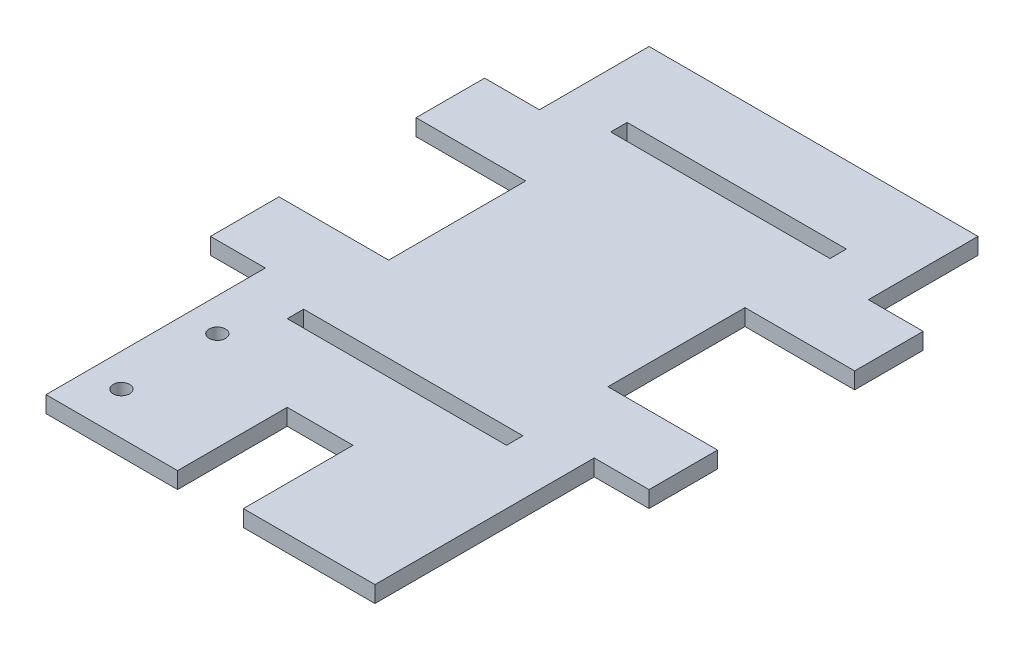
ISO-10303-21;
HEADER;
FILE_DESCRIPTION(('STEP AP214'),'2;1');
FILE_NAME('part.step','',(''),(''),'','','');
FILE_SCHEMA(('AUTOMOTIVE_DESIGN { 1 0 10303 214 1 1 1 1 }'));
ENDSEC;
DATA;
#1=APPLICATION_CONTEXT('core data for automotive mechanical design processes');
#2=APPLICATION_PROTOCOL_DEFINITION('international standard','automotive_design',2000,#1);
#3=PRODUCT_CONTEXT('',#1,'mechanical');
#4=PRODUCT('Part','Part','',(#3));
#5=PRODUCT_RELATED_PRODUCT_CATEGORY('part','',(#4));
#6=PRODUCT_DEFINITION_FORMATION('','',#4);
#7=PRODUCT_DEFINITION_CONTEXT('part definition',#1,'design');
#8=PRODUCT_DEFINITION('design','',#6,#7);
#9=PRODUCT_DEFINITION_SHAPE('','',#8);
#10=(LENGTH_UNIT() NAMED_UNIT(*) SI_UNIT(.MILLI.,.METRE.));
#11=(NAMED_UNIT(*) PLANE_ANGLE_UNIT() SI_UNIT($,.RADIAN.));
#12=(NAMED_UNIT(*) SI_UNIT($,.STERADIAN.) SOLID_ANGLE_UNIT());
#13=UNCERTAINTY_MEASURE_WITH_UNIT(LENGTH_MEASURE(1.E-05),#10,'distance_accuracy_value','');
#14=(GEOMETRIC_REPRESENTATION_CONTEXT(3) GLOBAL_UNCERTAINTY_ASSIGNED_CONTEXT((#13)) GLOBAL_UNIT_ASSIGNED_CONTEXT((#10,
#11,#12)) REPRESENTATION_CONTEXT('',''));
#15=CARTESIAN_POINT('',(0.,0.,0.));
#16=DIRECTION('',(0.,0.,1.));
#17=DIRECTION('',(1.,0.,0.));
#18=AXIS2_PLACEMENT_3D('',#15,#16,#17);
#19=CARTESIAN_POINT('',(0.,3.,40.));
#20=DIRECTION('',(0.,0.,-1.));
#21=DIRECTION('',(-1.,0.,0.));
#22=AXIS2_PLACEMENT_3D('',#19,#20,#21);
#23=PLANE('',#22);
#24=DIRECTION('',(0.,-1.,0.));
#25=VECTOR('',#24,1.);
#26=CARTESIAN_POINT('',(46.,10.,40.));
#27=LINE('',#26,#25);
#28=CARTESIAN_POINT('',(46.,3.,40.));
#29=VERTEX_POINT('',#28);
#30=CARTESIAN_POINT('',(46.,0.,40.));
#31=VERTEX_POINT('',#30);
#32=EDGE_CURVE('E523',#29,#31,#27,.T.);
#33=ORIENTED_EDGE('',*,*,#32,.T.);
#34=DIRECTION('',(1.,0.,0.));
#35=VECTOR('',#34,1.);
#36=CARTESIAN_POINT('',(0.,0.,40.));
#37=LINE('',#36,#35);
#38=CARTESIAN_POINT('',(70.,0.,40.));
#39=VERTEX_POINT('',#38);
#40=EDGE_CURVE('E444',#31,#39,#37,.T.);
#41=ORIENTED_EDGE('',*,*,#40,.T.);
#42=DIRECTION('',(0.,-1.,0.));
#43=VECTOR('',#42,1.);
#44=CARTESIAN_POINT('',(70.,3.,40.));
#45=LINE('',#44,#43);
#46=CARTESIAN_POINT('',(70.,3.,40.));
#47=VERTEX_POINT('',#46);
#48=EDGE_CURVE('E396',#47,#39,#45,.T.);
#49=ORIENTED_EDGE('',*,*,#48,.F.);
#50=DIRECTION('',(1.,0.,0.));
#51=VECTOR('',#50,1.);
#52=CARTESIAN_POINT('',(0.,3.,40.));
#53=LINE('',#52,#51);
#54=EDGE_CURVE('E522',#29,#47,#53,.T.);
#55=ORIENTED_EDGE('',*,*,#54,.F.);
#56=EDGE_LOOP('',(#33,#41,#49,#55));
#57=FACE_BOUND('',#56,.T.);
#58=ADVANCED_FACE('F43',(#57),#23,.F.);
#59=CARTESIAN_POINT('',(70.,3.,0.));
#60=DIRECTION('',(-1.,0.,0.));
#61=DIRECTION('',(0.,0.,1.));
#62=AXIS2_PLACEMENT_3D('',#59,#60,#61);
#63=PLANE('',#62);
#64=DIRECTION('',(0.,-1.,0.));
#65=VECTOR('',#64,1.);
#66=CARTESIAN_POINT('',(70.,10.,-70.));
#67=LINE('',#66,#65);
#68=CARTESIAN_POINT('',(70.,3.,-70.));
#69=VERTEX_POINT('',#68);
#70=CARTESIAN_POINT('',(70.,0.,-70.));
#71=VERTEX_POINT('',#70);
#72=EDGE_CURVE('E69',#69,#71,#67,.T.);
#73=ORIENTED_EDGE('',*,*,#72,.F.);
#74=DIRECTION('',(0.,0.,-1.));
#75=VECTOR('',#74,1.);
#76=CARTESIAN_POINT('',(70.,3.,0.));
#77=LINE('',#76,#75);
#78=CARTESIAN_POINT('',(70.,3.,-50.));
#79=VERTEX_POINT('',#78);
#80=EDGE_CURVE('E601',#79,#69,#77,.T.);
#81=ORIENTED_EDGE('',*,*,#80,.F.);
#82=DIRECTION('',(0.,-1.,0.));
#83=VECTOR('',#82,1.);
#84=CARTESIAN_POINT('',(70.,3.,-50.));
#85=LINE('',#84,#83);
#86=CARTESIAN_POINT('',(70.,0.,-50.));
#87=VERTEX_POINT('',#86);
#88=EDGE_CURVE('E369',#79,#87,#85,.T.);
#89=ORIENTED_EDGE('',*,*,#88,.T.);
#90=DIRECTION('',(0.,0.,-1.));
#91=VECTOR('',#90,1.);
#92=CARTESIAN_POINT('',(70.,0.,0.));
#93=LINE('',#92,#91);
#94=EDGE_CURVE('E280',#87,#71,#93,.T.);
#95=ORIENTED_EDGE('',*,*,#94,.T.);
#96=EDGE_LOOP('',(#73,#81,#89,#95));
#97=FACE_BOUND('',#96,.T.);
#98=ADVANCED_FACE('F676',(#97),#63,.F.);
#99=CARTESIAN_POINT('',(9.99999999999999,3.,0.));
#100=DIRECTION('',(-1.,0.,0.));
#101=DIRECTION('',(0.,0.,1.));
#102=AXIS2_PLACEMENT_3D('',#99,#100,#101);
#103=PLANE('',#102);
#104=DIRECTION('',(0.,0.,-1.));
#105=VECTOR('',#104,1.);
#106=CARTESIAN_POINT('',(9.99999999999999,3.,0.));
#107=LINE('',#106,#105);
#108=CARTESIAN_POINT('',(10.,3.,-50.));
#109=VERTEX_POINT('',#108);
#110=CARTESIAN_POINT('',(10.,3.,-70.));
#111=VERTEX_POINT('',#110);
#112=EDGE_CURVE('E272',#109,#111,#107,.T.);
#113=ORIENTED_EDGE('',*,*,#112,.T.);
#114=DIRECTION('',(0.,-1.,0.));
#115=VECTOR('',#114,1.);
#116=CARTESIAN_POINT('',(10.,10.,-70.));
#117=LINE('',#116,#115);
#118=CARTESIAN_POINT('',(10.,0.,-70.));
#119=VERTEX_POINT('',#118);
#120=EDGE_CURVE('E256',#111,#119,#117,.T.);
#121=ORIENTED_EDGE('',*,*,#120,.T.);
#122=DIRECTION('',(0.,0.,-1.));
#123=VECTOR('',#122,1.);
#124=CARTESIAN_POINT('',(9.99999999999999,0.,0.));
#125=LINE('',#124,#123);
#126=CARTESIAN_POINT('',(10.,0.,-50.));
#127=VERTEX_POINT('',#126);
#128=EDGE_CURVE('E269',#127,#119,#125,.T.);
#129=ORIENTED_EDGE('',*,*,#128,.F.);
#130=DIRECTION('',(0.,-1.,0.));
#131=VECTOR('',#130,1.);
#132=CARTESIAN_POINT('',(10.,3.,-50.));
#133=LINE('',#132,#131);
#134=EDGE_CURVE('E366',#109,#127,#133,.T.);
#135=ORIENTED_EDGE('',*,*,#134,.F.);
#136=EDGE_LOOP('',(#113,#121,#129,#135));
#137=FACE_BOUND('',#136,.T.);
#138=ADVANCED_FACE('F268',(#137),#103,.T.);
#139=CARTESIAN_POINT('',(0.,3.,0.));
#140=DIRECTION('',(0.,1.,0.));
#141=DIRECTION('',(0.,0.,1.));
#142=AXIS2_PLACEMENT_3D('',#139,#140,#141);
#143=PLANE('',#142);
#144=CARTESIAN_POINT('',(16.,3.,14.75));
#145=DIRECTION('',(0.,1.,0.));
#146=DIRECTION('',(0.,0.,1.));
#147=AXIS2_PLACEMENT_3D('',#144,#145,#146);
#148=CIRCLE('',#147,1.5);
#149=CARTESIAN_POINT('',(16.,3.,16.25));
#150=VERTEX_POINT('',#149);
#151=EDGE_CURVE('E560',#150,#150,#148,.F.);
#152=ORIENTED_EDGE('',*,*,#151,.T.);
#153=EDGE_LOOP('',(#152));
#154=FACE_BOUND('',#153,.T.);
#155=DIRECTION('',(1.,0.,0.));
#156=VECTOR('',#155,1.);
#157=CARTESIAN_POINT('',(0.,3.,3.));
#158=LINE('',#157,#156);
#159=CARTESIAN_POINT('',(20.,3.,3.));
#160=VERTEX_POINT('',#159);
#161=CARTESIAN_POINT('',(60.,3.,3.));
#162=VERTEX_POINT('',#161);
#163=EDGE_CURVE('E618',#160,#162,#158,.T.);
#164=ORIENTED_EDGE('',*,*,#163,.T.);
#165=DIRECTION('',(0.,0.,1.));
#166=VECTOR('',#165,1.);
#167=CARTESIAN_POINT('',(60.,3.,1.38777878078145E-13));
#168=LINE('',#167,#166);
#169=CARTESIAN_POINT('',(60.,3.,6.));
#170=VERTEX_POINT('',#169);
#171=EDGE_CURVE('E622',#162,#170,#168,.T.);
#172=ORIENTED_EDGE('',*,*,#171,.T.);
#173=DIRECTION('',(1.,0.,0.));
#174=VECTOR('',#173,1.);
#175=CARTESIAN_POINT('',(0.,3.,6.));
#176=LINE('',#175,#174);
#177=CARTESIAN_POINT('',(20.,3.,6.));
#178=VERTEX_POINT('',#177);
#179=EDGE_CURVE('E625',#178,#170,#176,.T.);
#180=ORIENTED_EDGE('',*,*,#179,.F.);
#181=DIRECTION('',(0.,0.,1.));
#182=VECTOR('',#181,1.);
#183=CARTESIAN_POINT('',(20.,3.,0.));
#184=LINE('',#183,#182);
#185=EDGE_CURVE('E629',#160,#178,#184,.T.);
#186=ORIENTED_EDGE('',*,*,#185,.F.);
#187=EDGE_LOOP('',(#164,#172,#180,#186));
#188=FACE_BOUND('',#187,.T.);
#189=DIRECTION('',(0.,0.,-1.));
#190=VECTOR('',#189,1.);
#191=CARTESIAN_POINT('',(19.9999999999999,3.,0.));
#192=LINE('',#191,#190);
#193=CARTESIAN_POINT('',(20.,3.,-53.));
#194=VERTEX_POINT('',#193);
#195=CARTESIAN_POINT('',(20.,3.,-56.));
#196=VERTEX_POINT('',#195);
#197=EDGE_CURVE('E633',#194,#196,#192,.T.);
#198=ORIENTED_EDGE('',*,*,#197,.T.);
#199=DIRECTION('',(1.,0.,0.));
#200=VECTOR('',#199,1.);
#201=CARTESIAN_POINT('',(0.,3.,-56.));
#202=LINE('',#201,#200);
#203=CARTESIAN_POINT('',(60.,3.,-56.));
#204=VERTEX_POINT('',#203);
#205=EDGE_CURVE('E637',#196,#204,#202,.T.);
#206=ORIENTED_EDGE('',*,*,#205,.T.);
#207=DIRECTION('',(0.,0.,-1.));
#208=VECTOR('',#207,1.);
#209=CARTESIAN_POINT('',(60.0000000000001,3.,-1.38777878078145E-13));
#210=LINE('',#209,#208);
#211=CARTESIAN_POINT('',(60.,3.,-53.));
#212=VERTEX_POINT('',#211);
#213=EDGE_CURVE('E640',#212,#204,#210,.T.);
#214=ORIENTED_EDGE('',*,*,#213,.F.);
#215=DIRECTION('',(1.,0.,0.));
#216=VECTOR('',#215,1.);
#217=CARTESIAN_POINT('',(0.,3.,-53.));
#218=LINE('',#217,#216);
#219=EDGE_CURVE('E356',#194,#212,#218,.T.);
#220=ORIENTED_EDGE('',*,*,#219,.F.);
#221=EDGE_LOOP('',(#198,#206,#214,#220));
#222=FACE_BOUND('',#221,.T.);
#223=CARTESIAN_POINT('',(16.,3.,32.25));
#224=DIRECTION('',(0.,1.,0.));
#225=DIRECTION('',(0.,0.,1.));
#226=AXIS2_PLACEMENT_3D('',#223,#224,#225);
#227=CIRCLE('',#226,1.5);
#228=CARTESIAN_POINT('',(16.,3.,33.75));
#229=VERTEX_POINT('',#228);
#230=EDGE_CURVE('E564',#229,#229,#227,.F.);
#231=ORIENTED_EDGE('',*,*,#230,.T.);
#232=EDGE_LOOP('',(#231));
#233=FACE_BOUND('',#232,.T.);
#234=ORIENTED_EDGE('',*,*,#80,.T.);
#235=DIRECTION('',(-1.,0.,0.));
#236=VECTOR('',#235,1.);
#237=CARTESIAN_POINT('',(0.,3.,-70.));
#238=LINE('',#237,#236);
#239=EDGE_CURVE('E430',#69,#111,#238,.T.);
#240=ORIENTED_EDGE('',*,*,#239,.T.);
#241=ORIENTED_EDGE('',*,*,#112,.F.);
#242=DIRECTION('',(1.,0.,0.));
#243=VECTOR('',#242,1.);
#244=CARTESIAN_POINT('',(0.,3.,-50.));
#245=LINE('',#244,#243);
#246=CARTESIAN_POINT('',(0.,3.,-50.));
#247=VERTEX_POINT('',#246);
#248=EDGE_CURVE('E602',#247,#109,#245,.T.);
#249=ORIENTED_EDGE('',*,*,#248,.F.);
#250=DIRECTION('',(0.,0.,-1.));
#251=VECTOR('',#250,1.);
#252=CARTESIAN_POINT('',(0.,3.,0.));
#253=LINE('',#252,#251);
#254=CARTESIAN_POINT('',(0.,3.,-37.5));
#255=VERTEX_POINT('',#254);
#256=EDGE_CURVE('E608',#255,#247,#253,.T.);
#257=ORIENTED_EDGE('',*,*,#256,.F.);
#258=DIRECTION('',(1.,0.,0.));
#259=VECTOR('',#258,1.);
#260=CARTESIAN_POINT('',(0.,3.,-37.5));
#261=LINE('',#260,#259);
#262=CARTESIAN_POINT('',(20.,3.,-37.5));
#263=VERTEX_POINT('',#262);
#264=EDGE_CURVE('E612',#255,#263,#261,.T.);
#265=ORIENTED_EDGE('',*,*,#264,.T.);
#266=DIRECTION('',(0.,0.,1.));
#267=VECTOR('',#266,1.);
#268=CARTESIAN_POINT('',(20.,3.,0.));
#269=LINE('',#268,#267);
#270=CARTESIAN_POINT('',(20.,3.,-12.5));
#271=VERTEX_POINT('',#270);
#272=EDGE_CURVE('E615',#263,#271,#269,.T.);
#273=ORIENTED_EDGE('',*,*,#272,.T.);
#274=DIRECTION('',(1.,0.,0.));
#275=VECTOR('',#274,1.);
#276=CARTESIAN_POINT('',(0.,3.,-12.5));
#277=LINE('',#276,#275);
#278=CARTESIAN_POINT('',(0.,3.,-12.5));
#279=VERTEX_POINT('',#278);
#280=EDGE_CURVE('E330',#279,#271,#277,.T.);
#281=ORIENTED_EDGE('',*,*,#280,.F.);
#282=DIRECTION('',(0.,0.,-1.));
#283=VECTOR('',#282,1.);
#284=CARTESIAN_POINT('',(0.,3.,0.));
#285=LINE('',#284,#283);
#286=CARTESIAN_POINT('',(0.,3.,0.));
#287=VERTEX_POINT('',#286);
#288=EDGE_CURVE('E421',#287,#279,#285,.T.);
#289=ORIENTED_EDGE('',*,*,#288,.F.);
#290=DIRECTION('',(1.,0.,0.));
#291=VECTOR('',#290,1.);
#292=CARTESIAN_POINT('',(0.,3.,0.));
#293=LINE('',#292,#291);
#294=CARTESIAN_POINT('',(10.,3.,0.));
#295=VERTEX_POINT('',#294);
#296=EDGE_CURVE('E574',#287,#295,#293,.T.);
#297=ORIENTED_EDGE('',*,*,#296,.T.);
#298=DIRECTION('',(0.,0.,1.));
#299=VECTOR('',#298,1.);
#300=CARTESIAN_POINT('',(10.,3.,0.));
#301=LINE('',#300,#299);
#302=CARTESIAN_POINT('',(10.,3.,40.));
#303=VERTEX_POINT('',#302);
#304=EDGE_CURVE('E577',#295,#303,#301,.T.);
#305=ORIENTED_EDGE('',*,*,#304,.T.);
#306=CARTESIAN_POINT('',(34.,3.,40.));
#307=VERTEX_POINT('',#306);
#308=EDGE_CURVE('E581',#303,#307,#53,.T.);
#309=ORIENTED_EDGE('',*,*,#308,.T.);
#310=DIRECTION('',(0.,0.,1.));
#311=VECTOR('',#310,1.);
#312=CARTESIAN_POINT('',(34.,3.,0.));
#313=LINE('',#312,#311);
#314=CARTESIAN_POINT('',(34.,3.,20.));
#315=VERTEX_POINT('',#314);
#316=EDGE_CURVE('E557',#315,#307,#313,.T.);
#317=ORIENTED_EDGE('',*,*,#316,.F.);
#318=DIRECTION('',(-1.,0.,0.));
#319=VECTOR('',#318,1.);
#320=CARTESIAN_POINT('',(0.,3.,20.));
#321=LINE('',#320,#319);
#322=CARTESIAN_POINT('',(46.,3.,20.));
#323=VERTEX_POINT('',#322);
#324=EDGE_CURVE('E550',#323,#315,#321,.T.);
#325=ORIENTED_EDGE('',*,*,#324,.F.);
#326=DIRECTION('',(0.,0.,1.));
#327=VECTOR('',#326,1.);
#328=CARTESIAN_POINT('',(46.,3.,0.));
#329=LINE('',#328,#327);
#330=EDGE_CURVE('E553',#323,#29,#329,.T.);
#331=ORIENTED_EDGE('',*,*,#330,.T.);
#332=ORIENTED_EDGE('',*,*,#54,.T.);
#333=DIRECTION('',(0.,0.,1.));
#334=VECTOR('',#333,1.);
#335=CARTESIAN_POINT('',(70.,3.,0.));
#336=LINE('',#335,#334);
#337=CARTESIAN_POINT('',(70.,3.,0.));
#338=VERTEX_POINT('',#337);
#339=EDGE_CURVE('E518',#338,#47,#336,.T.);
#340=ORIENTED_EDGE('',*,*,#339,.F.);
#341=CARTESIAN_POINT('',(80.,3.,0.));
#342=VERTEX_POINT('',#341);
#343=EDGE_CURVE('E578',#338,#342,#293,.T.);
#344=ORIENTED_EDGE('',*,*,#343,.T.);
#345=DIRECTION('',(0.,0.,-1.));
#346=VECTOR('',#345,1.);
#347=CARTESIAN_POINT('',(80.,3.,0.));
#348=LINE('',#347,#346);
#349=CARTESIAN_POINT('',(80.,3.,-12.5));
#350=VERTEX_POINT('',#349);
#351=EDGE_CURVE('E587',#342,#350,#348,.T.);
#352=ORIENTED_EDGE('',*,*,#351,.T.);
#353=DIRECTION('',(1.,0.,0.));
#354=VECTOR('',#353,1.);
#355=CARTESIAN_POINT('',(0.,3.,-12.5));
#356=LINE('',#355,#354);
#357=CARTESIAN_POINT('',(60.,3.,-12.5));
#358=VERTEX_POINT('',#357);
#359=EDGE_CURVE('E502',#358,#350,#356,.T.);
#360=ORIENTED_EDGE('',*,*,#359,.F.);
#361=DIRECTION('',(0.,0.,-1.));
#362=VECTOR('',#361,1.);
#363=CARTESIAN_POINT('',(60.,3.,0.));
#364=LINE('',#363,#362);
#365=CARTESIAN_POINT('',(60.,3.,-37.5));
#366=VERTEX_POINT('',#365);
#367=EDGE_CURVE('E592',#358,#366,#364,.T.);
#368=ORIENTED_EDGE('',*,*,#367,.T.);
#369=DIRECTION('',(1.,0.,0.));
#370=VECTOR('',#369,1.);
#371=CARTESIAN_POINT('',(0.,3.,-37.5));
#372=LINE('',#371,#370);
#373=CARTESIAN_POINT('',(80.,3.,-37.5));
#374=VERTEX_POINT('',#373);
#375=EDGE_CURVE('E490',#366,#374,#372,.T.);
#376=ORIENTED_EDGE('',*,*,#375,.T.);
#377=DIRECTION('',(0.,0.,-1.));
#378=VECTOR('',#377,1.);
#379=CARTESIAN_POINT('',(80.,3.,0.));
#380=LINE('',#379,#378);
#381=CARTESIAN_POINT('',(80.,3.,-50.));
#382=VERTEX_POINT('',#381);
#383=EDGE_CURVE('E486',#374,#382,#380,.T.);
#384=ORIENTED_EDGE('',*,*,#383,.T.);
#385=EDGE_CURVE('E481',#79,#382,#245,.T.);
#386=ORIENTED_EDGE('',*,*,#385,.F.);
#387=EDGE_LOOP('',(#234,#240,#241,#249,#257,#265,#273,#281,#289,#297,#305,#309,#317,#325,#331,
#332,#340,#344,#352,#360,#368,#376,#384,#386));
#388=FACE_BOUND('',#387,.T.);
#389=ADVANCED_FACE('F653',(#154,#188,#222,#233,#388),#143,.T.);
#390=CARTESIAN_POINT('',(0.,0.,0.));
#391=DIRECTION('',(0.,1.,0.));
#392=DIRECTION('',(0.,0.,1.));
#393=AXIS2_PLACEMENT_3D('',#390,#391,#392);
#394=PLANE('',#393);
#395=CARTESIAN_POINT('',(16.,0.,32.25));
#396=DIRECTION('',(0.,1.,0.));
#397=DIRECTION('',(0.,0.,1.));
#398=AXIS2_PLACEMENT_3D('',#395,#396,#397);
#399=CIRCLE('',#398,1.5);
#400=CARTESIAN_POINT('',(16.,0.,33.75));
#401=VERTEX_POINT('',#400);
#402=EDGE_CURVE('E263',#401,#401,#399,.T.);
#403=ORIENTED_EDGE('',*,*,#402,.T.);
#404=EDGE_LOOP('',(#403));
#405=FACE_BOUND('',#404,.T.);
#406=CARTESIAN_POINT('',(16.,0.,14.75));
#407=DIRECTION('',(0.,1.,0.));
#408=DIRECTION('',(0.,0.,1.));
#409=AXIS2_PLACEMENT_3D('',#406,#407,#408);
#410=CIRCLE('',#409,1.5);
#411=CARTESIAN_POINT('',(16.,0.,16.25));
#412=VERTEX_POINT('',#411);
#413=EDGE_CURVE('E723',#412,#412,#410,.T.);
#414=ORIENTED_EDGE('',*,*,#413,.T.);
#415=EDGE_LOOP('',(#414));
#416=FACE_BOUND('',#415,.T.);
#417=DIRECTION('',(0.,0.,-1.));
#418=VECTOR('',#417,1.);
#419=CARTESIAN_POINT('',(19.9999999999999,0.,0.));
#420=LINE('',#419,#418);
#421=CARTESIAN_POINT('',(20.,0.,-53.));
#422=VERTEX_POINT('',#421);
#423=CARTESIAN_POINT('',(20.,0.,-56.));
#424=VERTEX_POINT('',#423);
#425=EDGE_CURVE('E314',#422,#424,#420,.T.);
#426=ORIENTED_EDGE('',*,*,#425,.F.);
#427=DIRECTION('',(1.,0.,0.));
#428=VECTOR('',#427,1.);
#429=CARTESIAN_POINT('',(0.,0.,-53.));
#430=LINE('',#429,#428);
#431=CARTESIAN_POINT('',(60.,0.,-53.));
#432=VERTEX_POINT('',#431);
#433=EDGE_CURVE('E326',#422,#432,#430,.T.);
#434=ORIENTED_EDGE('',*,*,#433,.T.);
#435=DIRECTION('',(0.,0.,-1.));
#436=VECTOR('',#435,1.);
#437=CARTESIAN_POINT('',(60.0000000000001,0.,-1.38777878078145E-13));
#438=LINE('',#437,#436);
#439=CARTESIAN_POINT('',(60.,0.,-56.));
#440=VERTEX_POINT('',#439);
#441=EDGE_CURVE('E322',#432,#440,#438,.T.);
#442=ORIENTED_EDGE('',*,*,#441,.T.);
#443=DIRECTION('',(1.,0.,0.));
#444=VECTOR('',#443,1.);
#445=CARTESIAN_POINT('',(0.,0.,-56.));
#446=LINE('',#445,#444);
#447=EDGE_CURVE('E318',#424,#440,#446,.T.);
#448=ORIENTED_EDGE('',*,*,#447,.F.);
#449=EDGE_LOOP('',(#426,#434,#442,#448));
#450=FACE_BOUND('',#449,.T.);
#451=DIRECTION('',(1.,0.,0.));
#452=VECTOR('',#451,1.);
#453=CARTESIAN_POINT('',(0.,0.,3.));
#454=LINE('',#453,#452);
#455=CARTESIAN_POINT('',(20.,0.,3.));
#456=VERTEX_POINT('',#455);
#457=CARTESIAN_POINT('',(60.,0.,3.));
#458=VERTEX_POINT('',#457);
#459=EDGE_CURVE('E298',#456,#458,#454,.T.);
#460=ORIENTED_EDGE('',*,*,#459,.F.);
#461=DIRECTION('',(0.,0.,1.));
#462=VECTOR('',#461,1.);
#463=CARTESIAN_POINT('',(20.,0.,0.));
#464=LINE('',#463,#462);
#465=CARTESIAN_POINT('',(20.,0.,6.));
#466=VERTEX_POINT('',#465);
#467=EDGE_CURVE('E310',#456,#466,#464,.T.);
#468=ORIENTED_EDGE('',*,*,#467,.T.);
#469=DIRECTION('',(1.,0.,0.));
#470=VECTOR('',#469,1.);
#471=CARTESIAN_POINT('',(0.,0.,6.));
#472=LINE('',#471,#470);
#473=CARTESIAN_POINT('',(60.,0.,6.));
#474=VERTEX_POINT('',#473);
#475=EDGE_CURVE('E306',#466,#474,#472,.T.);
#476=ORIENTED_EDGE('',*,*,#475,.T.);
#477=DIRECTION('',(0.,0.,1.));
#478=VECTOR('',#477,1.);
#479=CARTESIAN_POINT('',(60.,0.,1.38777878078145E-13));
#480=LINE('',#479,#478);
#481=EDGE_CURVE('E302',#458,#474,#480,.T.);
#482=ORIENTED_EDGE('',*,*,#481,.F.);
#483=EDGE_LOOP('',(#460,#468,#476,#482));
#484=FACE_BOUND('',#483,.T.);
#485=DIRECTION('',(1.,0.,0.));
#486=VECTOR('',#485,1.);
#487=CARTESIAN_POINT('',(0.,0.,-70.));
#488=LINE('',#487,#486);
#489=EDGE_CURVE('E253',#119,#71,#488,.T.);
#490=ORIENTED_EDGE('',*,*,#489,.T.);
#491=ORIENTED_EDGE('',*,*,#94,.F.);
#492=DIRECTION('',(1.,0.,0.));
#493=VECTOR('',#492,1.);
#494=CARTESIAN_POINT('',(0.,0.,-50.));
#495=LINE('',#494,#493);
#496=CARTESIAN_POINT('',(80.,0.,-50.));
#497=VERTEX_POINT('',#496);
#498=EDGE_CURVE('E286',#87,#497,#495,.T.);
#499=ORIENTED_EDGE('',*,*,#498,.T.);
#500=DIRECTION('',(0.,0.,-1.));
#501=VECTOR('',#500,1.);
#502=CARTESIAN_POINT('',(80.,0.,0.));
#503=LINE('',#502,#501);
#504=CARTESIAN_POINT('',(80.,0.,-37.5));
#505=VERTEX_POINT('',#504);
#506=EDGE_CURVE('E467',#505,#497,#503,.T.);
#507=ORIENTED_EDGE('',*,*,#506,.F.);
#508=DIRECTION('',(1.,0.,0.));
#509=VECTOR('',#508,1.);
#510=CARTESIAN_POINT('',(0.,0.,-37.5));
#511=LINE('',#510,#509);
#512=CARTESIAN_POINT('',(60.,0.,-37.5));
#513=VERTEX_POINT('',#512);
#514=EDGE_CURVE('E464',#513,#505,#511,.T.);
#515=ORIENTED_EDGE('',*,*,#514,.F.);
#516=DIRECTION('',(0.,0.,-1.));
#517=VECTOR('',#516,1.);
#518=CARTESIAN_POINT('',(60.,0.,0.));
#519=LINE('',#518,#517);
#520=CARTESIAN_POINT('',(60.,0.,-12.5));
#521=VERTEX_POINT('',#520);
#522=EDGE_CURVE('E461',#521,#513,#519,.T.);
#523=ORIENTED_EDGE('',*,*,#522,.F.);
#524=DIRECTION('',(1.,0.,0.));
#525=VECTOR('',#524,1.);
#526=CARTESIAN_POINT('',(0.,0.,-12.5));
#527=LINE('',#526,#525);
#528=CARTESIAN_POINT('',(80.,0.,-12.5));
#529=VERTEX_POINT('',#528);
#530=EDGE_CURVE('E457',#521,#529,#527,.T.);
#531=ORIENTED_EDGE('',*,*,#530,.T.);
#532=DIRECTION('',(0.,0.,-1.));
#533=VECTOR('',#532,1.);
#534=CARTESIAN_POINT('',(80.,0.,0.));
#535=LINE('',#534,#533);
#536=CARTESIAN_POINT('',(80.,0.,0.));
#537=VERTEX_POINT('',#536);
#538=EDGE_CURVE('E453',#537,#529,#535,.T.);
#539=ORIENTED_EDGE('',*,*,#538,.F.);
#540=DIRECTION('',(1.,0.,0.));
#541=VECTOR('',#540,1.);
#542=CARTESIAN_POINT('',(0.,0.,0.));
#543=LINE('',#542,#541);
#544=CARTESIAN_POINT('',(70.,0.,0.));
#545=VERTEX_POINT('',#544);
#546=EDGE_CURVE('E439',#545,#537,#543,.T.);
#547=ORIENTED_EDGE('',*,*,#546,.F.);
#548=DIRECTION('',(0.,0.,1.));
#549=VECTOR('',#548,1.);
#550=CARTESIAN_POINT('',(70.,0.,0.));
#551=LINE('',#550,#549);
#552=EDGE_CURVE('E449',#545,#39,#551,.T.);
#553=ORIENTED_EDGE('',*,*,#552,.T.);
#554=ORIENTED_EDGE('',*,*,#40,.F.);
#555=DIRECTION('',(0.,0.,-1.));
#556=VECTOR('',#555,1.);
#557=CARTESIAN_POINT('',(46.,0.,0.));
#558=LINE('',#557,#556);
#559=CARTESIAN_POINT('',(46.,0.,20.));
#560=VERTEX_POINT('',#559);
#561=EDGE_CURVE('E527',#31,#560,#558,.T.);
#562=ORIENTED_EDGE('',*,*,#561,.T.);
#563=DIRECTION('',(1.,0.,0.));
#564=VECTOR('',#563,1.);
#565=CARTESIAN_POINT('',(0.,0.,20.));
#566=LINE('',#565,#564);
#567=CARTESIAN_POINT('',(34.,0.,20.));
#568=VERTEX_POINT('',#567);
#569=EDGE_CURVE('E529',#568,#560,#566,.T.);
#570=ORIENTED_EDGE('',*,*,#569,.F.);
#571=DIRECTION('',(0.,0.,-1.));
#572=VECTOR('',#571,1.);
#573=CARTESIAN_POINT('',(34.,0.,0.));
#574=LINE('',#573,#572);
#575=CARTESIAN_POINT('',(34.,0.,40.));
#576=VERTEX_POINT('',#575);
#577=EDGE_CURVE('E61',#576,#568,#574,.T.);
#578=ORIENTED_EDGE('',*,*,#577,.F.);
#579=CARTESIAN_POINT('',(10.,0.,40.));
#580=VERTEX_POINT('',#579);
#581=EDGE_CURVE('E445',#580,#576,#37,.T.);
#582=ORIENTED_EDGE('',*,*,#581,.F.);
#583=DIRECTION('',(0.,0.,1.));
#584=VECTOR('',#583,1.);
#585=CARTESIAN_POINT('',(10.,0.,0.));
#586=LINE('',#585,#584);
#587=CARTESIAN_POINT('',(10.,0.,0.));
#588=VERTEX_POINT('',#587);
#589=EDGE_CURVE('E437',#588,#580,#586,.T.);
#590=ORIENTED_EDGE('',*,*,#589,.F.);
#591=CARTESIAN_POINT('',(0.,0.,0.));
#592=VERTEX_POINT('',#591);
#593=EDGE_CURVE('E433',#592,#588,#543,.T.);
#594=ORIENTED_EDGE('',*,*,#593,.F.);
#595=DIRECTION('',(0.,0.,-1.));
#596=VECTOR('',#595,1.);
#597=CARTESIAN_POINT('',(0.,0.,0.));
#598=LINE('',#597,#596);
#599=CARTESIAN_POINT('',(0.,0.,-12.5));
#600=VERTEX_POINT('',#599);
#601=EDGE_CURVE('E419',#592,#600,#598,.T.);
#602=ORIENTED_EDGE('',*,*,#601,.T.);
#603=DIRECTION('',(1.,0.,0.));
#604=VECTOR('',#603,1.);
#605=CARTESIAN_POINT('',(0.,0.,-12.5));
#606=LINE('',#605,#604);
#607=CARTESIAN_POINT('',(20.,0.,-12.5));
#608=VERTEX_POINT('',#607);
#609=EDGE_CURVE('E426',#600,#608,#606,.T.);
#610=ORIENTED_EDGE('',*,*,#609,.T.);
#611=DIRECTION('',(0.,0.,1.));
#612=VECTOR('',#611,1.);
#613=CARTESIAN_POINT('',(20.,0.,0.));
#614=LINE('',#613,#612);
#615=CARTESIAN_POINT('',(20.,0.,-37.5));
#616=VERTEX_POINT('',#615);
#617=EDGE_CURVE('E294',#616,#608,#614,.T.);
#618=ORIENTED_EDGE('',*,*,#617,.F.);
#619=DIRECTION('',(1.,0.,0.));
#620=VECTOR('',#619,1.);
#621=CARTESIAN_POINT('',(0.,0.,-37.5));
#622=LINE('',#621,#620);
#623=CARTESIAN_POINT('',(0.,0.,-37.5));
#624=VERTEX_POINT('',#623);
#625=EDGE_CURVE('E291',#624,#616,#622,.T.);
#626=ORIENTED_EDGE('',*,*,#625,.F.);
#627=DIRECTION('',(0.,0.,-1.));
#628=VECTOR('',#627,1.);
#629=CARTESIAN_POINT('',(0.,0.,0.));
#630=LINE('',#629,#628);
#631=CARTESIAN_POINT('',(0.,0.,-50.));
#632=VERTEX_POINT('',#631);
#633=EDGE_CURVE('E284',#624,#632,#630,.T.);
#634=ORIENTED_EDGE('',*,*,#633,.T.);
#635=EDGE_CURVE('E278',#632,#127,#495,.T.);
#636=ORIENTED_EDGE('',*,*,#635,.T.);
#637=ORIENTED_EDGE('',*,*,#128,.T.);
#638=EDGE_LOOP('',(#490,#491,#499,#507,#515,#523,#531,#539,#547,#553,#554,#562,#570,#578,#582,
#590,#594,#602,#610,#618,#626,#634,#636,#637));
#639=FACE_BOUND('',#638,.T.);
#640=ADVANCED_FACE('F275',(#405,#416,#450,#484,#639),#394,.F.);
#641=CARTESIAN_POINT('',(19.9999999999999,3.,0.));
#642=DIRECTION('',(-1.,0.,0.));
#643=DIRECTION('',(0.,0.,1.));
#644=AXIS2_PLACEMENT_3D('',#641,#642,#643);
#645=PLANE('',#644);
#646=ORIENTED_EDGE('',*,*,#425,.T.);
#647=DIRECTION('',(0.,-1.,0.));
#648=VECTOR('',#647,1.);
#649=CARTESIAN_POINT('',(20.,3.,-56.));
#650=LINE('',#649,#648);
#651=EDGE_CURVE('E11',#196,#424,#650,.T.);
#652=ORIENTED_EDGE('',*,*,#651,.F.);
#653=ORIENTED_EDGE('',*,*,#197,.F.);
#654=DIRECTION('',(0.,-1.,0.));
#655=VECTOR('',#654,1.);
#656=CARTESIAN_POINT('',(20.,3.,-53.));
#657=LINE('',#656,#655);
#658=EDGE_CURVE('E331',#194,#422,#657,.T.);
#659=ORIENTED_EDGE('',*,*,#658,.T.);
#660=EDGE_LOOP('',(#646,#652,#653,#659));
#661=FACE_BOUND('',#660,.T.);
#662=ADVANCED_FACE('F663',(#661),#645,.F.);
#663=CARTESIAN_POINT('',(0.,3.,-56.));
#664=DIRECTION('',(0.,0.,-1.));
#665=DIRECTION('',(-1.,0.,0.));
#666=AXIS2_PLACEMENT_3D('',#663,#664,#665);
#667=PLANE('',#666);
#668=ORIENTED_EDGE('',*,*,#447,.T.);
#669=DIRECTION('',(0.,-1.,0.));
#670=VECTOR('',#669,1.);
#671=CARTESIAN_POINT('',(60.,3.,-56.));
#672=LINE('',#671,#670);
#673=EDGE_CURVE('E53',#204,#440,#672,.T.);
#674=ORIENTED_EDGE('',*,*,#673,.F.);
#675=ORIENTED_EDGE('',*,*,#205,.F.);
#676=ORIENTED_EDGE('',*,*,#651,.T.);
#677=EDGE_LOOP('',(#668,#674,#675,#676));
#678=FACE_BOUND('',#677,.T.);
#679=ADVANCED_FACE('F665',(#678),#667,.F.);
#680=CARTESIAN_POINT('',(60.0000000000001,3.,-1.38777878078145E-13));
#681=DIRECTION('',(-1.,0.,0.));
#682=DIRECTION('',(0.,0.,1.));
#683=AXIS2_PLACEMENT_3D('',#680,#681,#682);
#684=PLANE('',#683);
#685=ORIENTED_EDGE('',*,*,#441,.F.);
#686=DIRECTION('',(0.,-1.,0.));
#687=VECTOR('',#686,1.);
#688=CARTESIAN_POINT('',(60.,3.,-53.));
#689=LINE('',#688,#687);
#690=EDGE_CURVE('E334',#212,#432,#689,.T.);
#691=ORIENTED_EDGE('',*,*,#690,.F.);
#692=ORIENTED_EDGE('',*,*,#213,.T.);
#693=ORIENTED_EDGE('',*,*,#673,.T.);
#694=EDGE_LOOP('',(#685,#691,#692,#693));
#695=FACE_BOUND('',#694,.T.);
#696=ADVANCED_FACE('F658',(#695),#684,.T.);
#697=CARTESIAN_POINT('',(0.,3.,3.));
#698=DIRECTION('',(0.,0.,-1.));
#699=DIRECTION('',(-1.,0.,0.));
#700=AXIS2_PLACEMENT_3D('',#697,#698,#699);
#701=PLANE('',#700);
#702=ORIENTED_EDGE('',*,*,#459,.T.);
#703=DIRECTION('',(0.,-1.,0.));
#704=VECTOR('',#703,1.);
#705=CARTESIAN_POINT('',(60.,3.,3.));
#706=LINE('',#705,#704);
#707=EDGE_CURVE('E335',#162,#458,#706,.T.);
#708=ORIENTED_EDGE('',*,*,#707,.F.);
#709=ORIENTED_EDGE('',*,*,#163,.F.);
#710=DIRECTION('',(0.,-1.,0.));
#711=VECTOR('',#710,1.);
#712=CARTESIAN_POINT('',(20.,3.,3.));
#713=LINE('',#712,#711);
#714=EDGE_CURVE('E340',#160,#456,#713,.T.);
#715=ORIENTED_EDGE('',*,*,#714,.T.);
#716=EDGE_LOOP('',(#702,#708,#709,#715));
#717=FACE_BOUND('',#716,.T.);
#718=ADVANCED_FACE('F672',(#717),#701,.F.);
#719=CARTESIAN_POINT('',(60.,3.,1.38777878078145E-13));
#720=DIRECTION('',(1.,0.,0.));
#721=DIRECTION('',(0.,0.,-1.));
#722=AXIS2_PLACEMENT_3D('',#719,#720,#721);
#723=PLANE('',#722);
#724=ORIENTED_EDGE('',*,*,#481,.T.);
#725=DIRECTION('',(0.,-1.,0.));
#726=VECTOR('',#725,1.);
#727=CARTESIAN_POINT('',(60.,3.,6.));
#728=LINE('',#727,#726);
#729=EDGE_CURVE('E346',#170,#474,#728,.T.);
#730=ORIENTED_EDGE('',*,*,#729,.F.);
#731=ORIENTED_EDGE('',*,*,#171,.F.);
#732=ORIENTED_EDGE('',*,*,#707,.T.);
#733=EDGE_LOOP('',(#724,#730,#731,#732));
#734=FACE_BOUND('',#733,.T.);
#735=ADVANCED_FACE('F808',(#734),#723,.F.);
#736=CARTESIAN_POINT('',(0.,3.,6.));
#737=DIRECTION('',(0.,0.,-1.));
#738=DIRECTION('',(-1.,0.,0.));
#739=AXIS2_PLACEMENT_3D('',#736,#737,#738);
#740=PLANE('',#739);
#741=ORIENTED_EDGE('',*,*,#475,.F.);
#742=DIRECTION('',(0.,-1.,0.));
#743=VECTOR('',#742,1.);
#744=CARTESIAN_POINT('',(20.,3.,6.));
#745=LINE('',#744,#743);
#746=EDGE_CURVE('E343',#178,#466,#745,.T.);
#747=ORIENTED_EDGE('',*,*,#746,.F.);
#748=ORIENTED_EDGE('',*,*,#179,.T.);
#749=ORIENTED_EDGE('',*,*,#729,.T.);
#750=EDGE_LOOP('',(#741,#747,#748,#749));
#751=FACE_BOUND('',#750,.T.);
#752=ADVANCED_FACE('F804',(#751),#740,.T.);
#753=CARTESIAN_POINT('',(0.,3.,-12.5));
#754=DIRECTION('',(0.,0.,-1.));
#755=DIRECTION('',(-1.,0.,0.));
#756=AXIS2_PLACEMENT_3D('',#753,#754,#755);
#757=PLANE('',#756);
#758=ORIENTED_EDGE('',*,*,#609,.F.);
#759=DIRECTION('',(0.,-1.,0.));
#760=VECTOR('',#759,1.);
#761=CARTESIAN_POINT('',(0.,3.,-12.5));
#762=LINE('',#761,#760);
#763=EDGE_CURVE('E47',#279,#600,#762,.T.);
#764=ORIENTED_EDGE('',*,*,#763,.F.);
#765=ORIENTED_EDGE('',*,*,#280,.T.);
#766=DIRECTION('',(0.,-1.,0.));
#767=VECTOR('',#766,1.);
#768=CARTESIAN_POINT('',(20.,3.,-12.5));
#769=LINE('',#768,#767);
#770=EDGE_CURVE('E352',#271,#608,#769,.T.);
#771=ORIENTED_EDGE('',*,*,#770,.T.);
#772=EDGE_LOOP('',(#758,#764,#765,#771));
#773=FACE_BOUND('',#772,.T.);
#774=ADVANCED_FACE('F45',(#773),#757,.T.);
#775=CARTESIAN_POINT('',(0.,3.,0.));
#776=DIRECTION('',(-1.,0.,0.));
#777=DIRECTION('',(0.,0.,1.));
#778=AXIS2_PLACEMENT_3D('',#775,#776,#777);
#779=PLANE('',#778);
#780=ORIENTED_EDGE('',*,*,#601,.F.);
#781=DIRECTION('',(0.,-1.,0.));
#782=VECTOR('',#781,1.);
#783=CARTESIAN_POINT('',(0.,3.,0.));
#784=LINE('',#783,#782);
#785=EDGE_CURVE('E407',#287,#592,#784,.T.);
#786=ORIENTED_EDGE('',*,*,#785,.F.);
#787=ORIENTED_EDGE('',*,*,#288,.T.);
#788=ORIENTED_EDGE('',*,*,#763,.T.);
#789=EDGE_LOOP('',(#780,#786,#787,#788));
#790=FACE_BOUND('',#789,.T.);
#791=ADVANCED_FACE('F417',(#790),#779,.T.);
#792=CARTESIAN_POINT('',(0.,3.,0.));
#793=DIRECTION('',(0.,0.,-1.));
#794=DIRECTION('',(-1.,0.,0.));
#795=AXIS2_PLACEMENT_3D('',#792,#793,#794);
#796=PLANE('',#795);
#797=ORIENTED_EDGE('',*,*,#593,.T.);
#798=DIRECTION('',(0.,-1.,0.));
#799=VECTOR('',#798,1.);
#800=CARTESIAN_POINT('',(10.,3.,0.));
#801=LINE('',#800,#799);
#802=EDGE_CURVE('E404',#295,#588,#801,.T.);
#803=ORIENTED_EDGE('',*,*,#802,.F.);
#804=ORIENTED_EDGE('',*,*,#296,.F.);
#805=ORIENTED_EDGE('',*,*,#785,.T.);
#806=EDGE_LOOP('',(#797,#803,#804,#805));
#807=FACE_BOUND('',#806,.T.);
#808=ADVANCED_FACE('F694',(#807),#796,.F.);
#809=CARTESIAN_POINT('',(10.,3.,0.));
#810=DIRECTION('',(1.,0.,0.));
#811=DIRECTION('',(0.,0.,-1.));
#812=AXIS2_PLACEMENT_3D('',#809,#810,#811);
#813=PLANE('',#812);
#814=ORIENTED_EDGE('',*,*,#589,.T.);
#815=DIRECTION('',(0.,-1.,0.));
#816=VECTOR('',#815,1.);
#817=CARTESIAN_POINT('',(10.,3.,40.));
#818=LINE('',#817,#816);
#819=EDGE_CURVE('E400',#303,#580,#818,.T.);
#820=ORIENTED_EDGE('',*,*,#819,.F.);
#821=ORIENTED_EDGE('',*,*,#304,.F.);
#822=ORIENTED_EDGE('',*,*,#802,.T.);
#823=EDGE_LOOP('',(#814,#820,#821,#822));
#824=FACE_BOUND('',#823,.T.);
#825=ADVANCED_FACE('F687',(#824),#813,.F.);
#826=ORIENTED_EDGE('',*,*,#581,.T.);
#827=DIRECTION('',(0.,-1.,0.));
#828=VECTOR('',#827,1.);
#829=CARTESIAN_POINT('',(34.,10.,40.));
#830=LINE('',#829,#828);
#831=EDGE_CURVE('E547',#307,#576,#830,.T.);
#832=ORIENTED_EDGE('',*,*,#831,.F.);
#833=ORIENTED_EDGE('',*,*,#308,.F.);
#834=ORIENTED_EDGE('',*,*,#819,.T.);
#835=EDGE_LOOP('',(#826,#832,#833,#834));
#836=FACE_BOUND('',#835,.T.);
#837=ADVANCED_FACE('F678',(#836),#23,.F.);
#838=CARTESIAN_POINT('',(70.,3.,0.));
#839=DIRECTION('',(1.,0.,0.));
#840=DIRECTION('',(0.,0.,-1.));
#841=AXIS2_PLACEMENT_3D('',#838,#839,#840);
#842=PLANE('',#841);
#843=ORIENTED_EDGE('',*,*,#552,.F.);
#844=DIRECTION('',(0.,-1.,0.));
#845=VECTOR('',#844,1.);
#846=CARTESIAN_POINT('',(70.,3.,0.));
#847=LINE('',#846,#845);
#848=EDGE_CURVE('E393',#338,#545,#847,.T.);
#849=ORIENTED_EDGE('',*,*,#848,.F.);
#850=ORIENTED_EDGE('',*,*,#339,.T.);
#851=ORIENTED_EDGE('',*,*,#48,.T.);
#852=EDGE_LOOP('',(#843,#849,#850,#851));
#853=FACE_BOUND('',#852,.T.);
#854=ADVANCED_FACE('F513',(#853),#842,.T.);
#855=ORIENTED_EDGE('',*,*,#546,.T.);
#856=DIRECTION('',(0.,-1.,0.));
#857=VECTOR('',#856,1.);
#858=CARTESIAN_POINT('',(80.,3.,0.));
#859=LINE('',#858,#857);
#860=EDGE_CURVE('E389',#342,#537,#859,.T.);
#861=ORIENTED_EDGE('',*,*,#860,.F.);
#862=ORIENTED_EDGE('',*,*,#343,.F.);
#863=ORIENTED_EDGE('',*,*,#848,.T.);
#864=EDGE_LOOP('',(#855,#861,#862,#863));
#865=FACE_BOUND('',#864,.T.);
#866=ADVANCED_FACE('F693',(#865),#796,.F.);
#867=CARTESIAN_POINT('',(80.,3.,0.));
#868=DIRECTION('',(-1.,0.,0.));
#869=DIRECTION('',(0.,0.,1.));
#870=AXIS2_PLACEMENT_3D('',#867,#868,#869);
#871=PLANE('',#870);
#872=ORIENTED_EDGE('',*,*,#538,.T.);
#873=DIRECTION('',(0.,-1.,0.));
#874=VECTOR('',#873,1.);
#875=CARTESIAN_POINT('',(80.,3.,-12.5));
#876=LINE('',#875,#874);
#877=EDGE_CURVE('E386',#350,#529,#876,.T.);
#878=ORIENTED_EDGE('',*,*,#877,.F.);
#879=ORIENTED_EDGE('',*,*,#351,.F.);
#880=ORIENTED_EDGE('',*,*,#860,.T.);
#881=EDGE_LOOP('',(#872,#878,#879,#880));
#882=FACE_BOUND('',#881,.T.);
#883=ADVANCED_FACE('F505',(#882),#871,.F.);
#884=CARTESIAN_POINT('',(0.,3.,-12.5));
#885=DIRECTION('',(0.,0.,-1.));
#886=DIRECTION('',(-1.,0.,0.));
#887=AXIS2_PLACEMENT_3D('',#884,#885,#886);
#888=PLANE('',#887);
#889=ORIENTED_EDGE('',*,*,#530,.F.);
#890=DIRECTION('',(0.,-1.,0.));
#891=VECTOR('',#890,1.);
#892=CARTESIAN_POINT('',(60.,3.,-12.5));
#893=LINE('',#892,#891);
#894=EDGE_CURVE('E383',#358,#521,#893,.T.);
#895=ORIENTED_EDGE('',*,*,#894,.F.);
#896=ORIENTED_EDGE('',*,*,#359,.T.);
#897=ORIENTED_EDGE('',*,*,#877,.T.);
#898=EDGE_LOOP('',(#889,#895,#896,#897));
#899=FACE_BOUND('',#898,.T.);
#900=ADVANCED_FACE('F497',(#899),#888,.T.);
#901=CARTESIAN_POINT('',(60.,3.,0.));
#902=DIRECTION('',(-1.,0.,0.));
#903=DIRECTION('',(0.,0.,1.));
#904=AXIS2_PLACEMENT_3D('',#901,#902,#903);
#905=PLANE('',#904);
#906=ORIENTED_EDGE('',*,*,#522,.T.);
#907=DIRECTION('',(0.,-1.,0.));
#908=VECTOR('',#907,1.);
#909=CARTESIAN_POINT('',(60.,3.,-37.5));
#910=LINE('',#909,#908);
#911=EDGE_CURVE('E379',#366,#513,#910,.T.);
#912=ORIENTED_EDGE('',*,*,#911,.F.);
#913=ORIENTED_EDGE('',*,*,#367,.F.);
#914=ORIENTED_EDGE('',*,*,#894,.T.);
#915=EDGE_LOOP('',(#906,#912,#913,#914));
#916=FACE_BOUND('',#915,.T.);
#917=ADVANCED_FACE('F787',(#916),#905,.F.);
#918=CARTESIAN_POINT('',(0.,3.,-37.5));
#919=DIRECTION('',(0.,0.,-1.));
#920=DIRECTION('',(-1.,0.,0.));
#921=AXIS2_PLACEMENT_3D('',#918,#919,#920);
#922=PLANE('',#921);
#923=ORIENTED_EDGE('',*,*,#514,.T.);
#924=DIRECTION('',(0.,-1.,0.));
#925=VECTOR('',#924,1.);
#926=CARTESIAN_POINT('',(80.,3.,-37.5));
#927=LINE('',#926,#925);
#928=EDGE_CURVE('E375',#374,#505,#927,.T.);
#929=ORIENTED_EDGE('',*,*,#928,.F.);
#930=ORIENTED_EDGE('',*,*,#375,.F.);
#931=ORIENTED_EDGE('',*,*,#911,.T.);
#932=EDGE_LOOP('',(#923,#929,#930,#931));
#933=FACE_BOUND('',#932,.T.);
#934=ADVANCED_FACE('F489',(#933),#922,.F.);
#935=CARTESIAN_POINT('',(80.,3.,0.));
#936=DIRECTION('',(-1.,0.,0.));
#937=DIRECTION('',(0.,0.,1.));
#938=AXIS2_PLACEMENT_3D('',#935,#936,#937);
#939=PLANE('',#938);
#940=ORIENTED_EDGE('',*,*,#506,.T.);
#941=DIRECTION('',(0.,-1.,0.));
#942=VECTOR('',#941,1.);
#943=CARTESIAN_POINT('',(80.,3.,-50.));
#944=LINE('',#943,#942);
#945=EDGE_CURVE('E372',#382,#497,#944,.T.);
#946=ORIENTED_EDGE('',*,*,#945,.F.);
#947=ORIENTED_EDGE('',*,*,#383,.F.);
#948=ORIENTED_EDGE('',*,*,#928,.T.);
#949=EDGE_LOOP('',(#940,#946,#947,#948));
#950=FACE_BOUND('',#949,.T.);
#951=ADVANCED_FACE('F484',(#950),#939,.F.);
#952=CARTESIAN_POINT('',(0.,3.,-50.));
#953=DIRECTION('',(0.,0.,-1.));
#954=DIRECTION('',(-1.,0.,0.));
#955=AXIS2_PLACEMENT_3D('',#952,#953,#954);
#956=PLANE('',#955);
#957=ORIENTED_EDGE('',*,*,#498,.F.);
#958=ORIENTED_EDGE('',*,*,#88,.F.);
#959=ORIENTED_EDGE('',*,*,#385,.T.);
#960=ORIENTED_EDGE('',*,*,#945,.T.);
#961=EDGE_LOOP('',(#957,#958,#959,#960));
#962=FACE_BOUND('',#961,.T.);
#963=ADVANCED_FACE('F476',(#962),#956,.T.);
#964=ORIENTED_EDGE('',*,*,#635,.F.);
#965=DIRECTION('',(0.,-1.,0.));
#966=VECTOR('',#965,1.);
#967=CARTESIAN_POINT('',(0.,3.,-50.));
#968=LINE('',#967,#966);
#969=EDGE_CURVE('E363',#247,#632,#968,.T.);
#970=ORIENTED_EDGE('',*,*,#969,.F.);
#971=ORIENTED_EDGE('',*,*,#248,.T.);
#972=ORIENTED_EDGE('',*,*,#134,.T.);
#973=EDGE_LOOP('',(#964,#970,#971,#972));
#974=FACE_BOUND('',#973,.T.);
#975=ADVANCED_FACE('F717',(#974),#956,.T.);
#976=CARTESIAN_POINT('',(0.,3.,0.));
#977=DIRECTION('',(-1.,0.,0.));
#978=DIRECTION('',(0.,0.,1.));
#979=AXIS2_PLACEMENT_3D('',#976,#977,#978);
#980=PLANE('',#979);
#981=ORIENTED_EDGE('',*,*,#633,.F.);
#982=DIRECTION('',(0.,-1.,0.));
#983=VECTOR('',#982,1.);
#984=CARTESIAN_POINT('',(0.,3.,-37.5));
#985=LINE('',#984,#983);
#986=EDGE_CURVE('E360',#255,#624,#985,.T.);
#987=ORIENTED_EDGE('',*,*,#986,.F.);
#988=ORIENTED_EDGE('',*,*,#256,.T.);
#989=ORIENTED_EDGE('',*,*,#969,.T.);
#990=EDGE_LOOP('',(#981,#987,#988,#989));
#991=FACE_BOUND('',#990,.T.);
#992=ADVANCED_FACE('F713',(#991),#980,.T.);
#993=CARTESIAN_POINT('',(0.,3.,-37.5));
#994=DIRECTION('',(0.,0.,-1.));
#995=DIRECTION('',(-1.,0.,0.));
#996=AXIS2_PLACEMENT_3D('',#993,#994,#995);
#997=PLANE('',#996);
#998=ORIENTED_EDGE('',*,*,#625,.T.);
#999=DIRECTION('',(0.,-1.,0.));
#1000=VECTOR('',#999,1.);
#1001=CARTESIAN_POINT('',(20.,3.,-37.5));
#1002=LINE('',#1001,#1000);
#1003=EDGE_CURVE('E355',#263,#616,#1002,.T.);
#1004=ORIENTED_EDGE('',*,*,#1003,.F.);
#1005=ORIENTED_EDGE('',*,*,#264,.F.);
#1006=ORIENTED_EDGE('',*,*,#986,.T.);
#1007=EDGE_LOOP('',(#998,#1004,#1005,#1006));
#1008=FACE_BOUND('',#1007,.T.);
#1009=ADVANCED_FACE('F769',(#1008),#997,.F.);
#1010=CARTESIAN_POINT('',(20.,3.,0.));
#1011=DIRECTION('',(1.,0.,0.));
#1012=DIRECTION('',(0.,0.,-1.));
#1013=AXIS2_PLACEMENT_3D('',#1010,#1011,#1012);
#1014=PLANE('',#1013);
#1015=ORIENTED_EDGE('',*,*,#467,.F.);
#1016=ORIENTED_EDGE('',*,*,#714,.F.);
#1017=ORIENTED_EDGE('',*,*,#185,.T.);
#1018=ORIENTED_EDGE('',*,*,#746,.T.);
#1019=EDGE_LOOP('',(#1015,#1016,#1017,#1018));
#1020=FACE_BOUND('',#1019,.T.);
#1021=ADVANCED_FACE('F764',(#1020),#1014,.T.);
#1022=CARTESIAN_POINT('',(20.,3.,0.));
#1023=DIRECTION('',(1.,0.,0.));
#1024=DIRECTION('',(0.,0.,-1.));
#1025=AXIS2_PLACEMENT_3D('',#1022,#1023,#1024);
#1026=PLANE('',#1025);
#1027=ORIENTED_EDGE('',*,*,#617,.T.);
#1028=ORIENTED_EDGE('',*,*,#770,.F.);
#1029=ORIENTED_EDGE('',*,*,#272,.F.);
#1030=ORIENTED_EDGE('',*,*,#1003,.T.);
#1031=EDGE_LOOP('',(#1027,#1028,#1029,#1030));
#1032=FACE_BOUND('',#1031,.T.);
#1033=ADVANCED_FACE('F708',(#1032),#1026,.F.);
#1034=CARTESIAN_POINT('',(0.,3.,-53.));
#1035=DIRECTION('',(0.,0.,-1.));
#1036=DIRECTION('',(-1.,0.,0.));
#1037=AXIS2_PLACEMENT_3D('',#1034,#1035,#1036);
#1038=PLANE('',#1037);
#1039=ORIENTED_EDGE('',*,*,#433,.F.);
#1040=ORIENTED_EDGE('',*,*,#658,.F.);
#1041=ORIENTED_EDGE('',*,*,#219,.T.);
#1042=ORIENTED_EDGE('',*,*,#690,.T.);
#1043=EDGE_LOOP('',(#1039,#1040,#1041,#1042));
#1044=FACE_BOUND('',#1043,.T.);
#1045=ADVANCED_FACE('F648',(#1044),#1038,.T.);
#1046=CARTESIAN_POINT('',(34.,10.,0.));
#1047=DIRECTION('',(-1.,0.,0.));
#1048=DIRECTION('',(0.,0.,1.));
#1049=AXIS2_PLACEMENT_3D('',#1046,#1047,#1048);
#1050=PLANE('',#1049);
#1051=ORIENTED_EDGE('',*,*,#316,.T.);
#1052=ORIENTED_EDGE('',*,*,#831,.T.);
#1053=ORIENTED_EDGE('',*,*,#577,.T.);
#1054=DIRECTION('',(0.,-1.,0.));
#1055=VECTOR('',#1054,1.);
#1056=CARTESIAN_POINT('',(34.,10.,20.));
#1057=LINE('',#1056,#1055);
#1058=EDGE_CURVE('E535',#315,#568,#1057,.T.);
#1059=ORIENTED_EDGE('',*,*,#1058,.F.);
#1060=EDGE_LOOP('',(#1051,#1052,#1053,#1059));
#1061=FACE_BOUND('',#1060,.T.);
#1062=ADVANCED_FACE('F752',(#1061),#1050,.F.);
#1063=CARTESIAN_POINT('',(46.,10.,0.));
#1064=DIRECTION('',(-1.,0.,0.));
#1065=DIRECTION('',(0.,0.,1.));
#1066=AXIS2_PLACEMENT_3D('',#1063,#1064,#1065);
#1067=PLANE('',#1066);
#1068=DIRECTION('',(0.,-1.,0.));
#1069=VECTOR('',#1068,1.);
#1070=CARTESIAN_POINT('',(46.,10.,20.));
#1071=LINE('',#1070,#1069);
#1072=EDGE_CURVE('E542',#323,#560,#1071,.T.);
#1073=ORIENTED_EDGE('',*,*,#1072,.T.);
#1074=ORIENTED_EDGE('',*,*,#561,.F.);
#1075=ORIENTED_EDGE('',*,*,#32,.F.);
#1076=ORIENTED_EDGE('',*,*,#330,.F.);
#1077=EDGE_LOOP('',(#1073,#1074,#1075,#1076));
#1078=FACE_BOUND('',#1077,.T.);
#1079=ADVANCED_FACE('F743',(#1078),#1067,.T.);
#1080=CARTESIAN_POINT('',(0.,10.,20.));
#1081=DIRECTION('',(0.,0.,-1.));
#1082=DIRECTION('',(-1.,0.,0.));
#1083=AXIS2_PLACEMENT_3D('',#1080,#1081,#1082);
#1084=PLANE('',#1083);
#1085=ORIENTED_EDGE('',*,*,#324,.T.);
#1086=ORIENTED_EDGE('',*,*,#1058,.T.);
#1087=ORIENTED_EDGE('',*,*,#569,.T.);
#1088=ORIENTED_EDGE('',*,*,#1072,.F.);
#1089=EDGE_LOOP('',(#1085,#1086,#1087,#1088));
#1090=FACE_BOUND('',#1089,.T.);
#1091=ADVANCED_FACE('F734',(#1090),#1084,.F.);
#1092=CARTESIAN_POINT('',(16.,10.,14.75));
#1093=DIRECTION('',(0.,-1.,0.));
#1094=DIRECTION('',(0.,0.,-1.));
#1095=AXIS2_PLACEMENT_3D('',#1092,#1093,#1094);
#1096=CYLINDRICAL_SURFACE('',#1095,1.5);
#1097=ORIENTED_EDGE('',*,*,#151,.F.);
#1098=EDGE_LOOP('',(#1097));
#1099=FACE_BOUND('',#1098,.T.);
#1100=ORIENTED_EDGE('',*,*,#413,.F.);
#1101=EDGE_LOOP('',(#1100));
#1102=FACE_BOUND('',#1101,.T.);
#1103=ADVANCED_FACE('F731',(#1099,#1102),#1096,.F.);
#1104=CARTESIAN_POINT('',(16.,10.,32.25));
#1105=DIRECTION('',(0.,-1.,0.));
#1106=DIRECTION('',(0.,0.,-1.));
#1107=AXIS2_PLACEMENT_3D('',#1104,#1105,#1106);
#1108=CYLINDRICAL_SURFACE('',#1107,1.5);
#1109=ORIENTED_EDGE('',*,*,#230,.F.);
#1110=EDGE_LOOP('',(#1109));
#1111=FACE_BOUND('',#1110,.T.);
#1112=ORIENTED_EDGE('',*,*,#402,.F.);
#1113=EDGE_LOOP('',(#1112));
#1114=FACE_BOUND('',#1113,.T.);
#1115=ADVANCED_FACE('F733',(#1111,#1114),#1108,.F.);
#1116=CARTESIAN_POINT('',(0.,10.,-70.));
#1117=DIRECTION('',(0.,0.,-1.));
#1118=DIRECTION('',(-1.,0.,0.));
#1119=AXIS2_PLACEMENT_3D('',#1116,#1117,#1118);
#1120=PLANE('',#1119);
#1121=ORIENTED_EDGE('',*,*,#72,.T.);
#1122=ORIENTED_EDGE('',*,*,#489,.F.);
#1123=ORIENTED_EDGE('',*,*,#120,.F.);
#1124=ORIENTED_EDGE('',*,*,#239,.F.);
#1125=EDGE_LOOP('',(#1121,#1122,#1123,#1124));
#1126=FACE_BOUND('',#1125,.T.);
#1127=ADVANCED_FACE('F255',(#1126),#1120,.T.);
#1128=CLOSED_SHELL('',(#58,#98,#138,#389,#640,#662,#679,#696,#718,#735,#752,#774,#791,#808,#825,
#837,#854,#866,#883,#900,#917,#934,#951,#963,#975,#992,#1009,#1021,#1033,#1045,#1062,#1079,
#1091,#1103,#1115,#1127));
#1129=MANIFOLD_SOLID_BREP('B2',#1128);
#1130=ADVANCED_BREP_SHAPE_REPRESENTATION('',(#18,#1129),#14);
#1131=SHAPE_DEFINITION_REPRESENTATION(#9,#1130);
ENDSEC;
END-ISO-10303-21;
